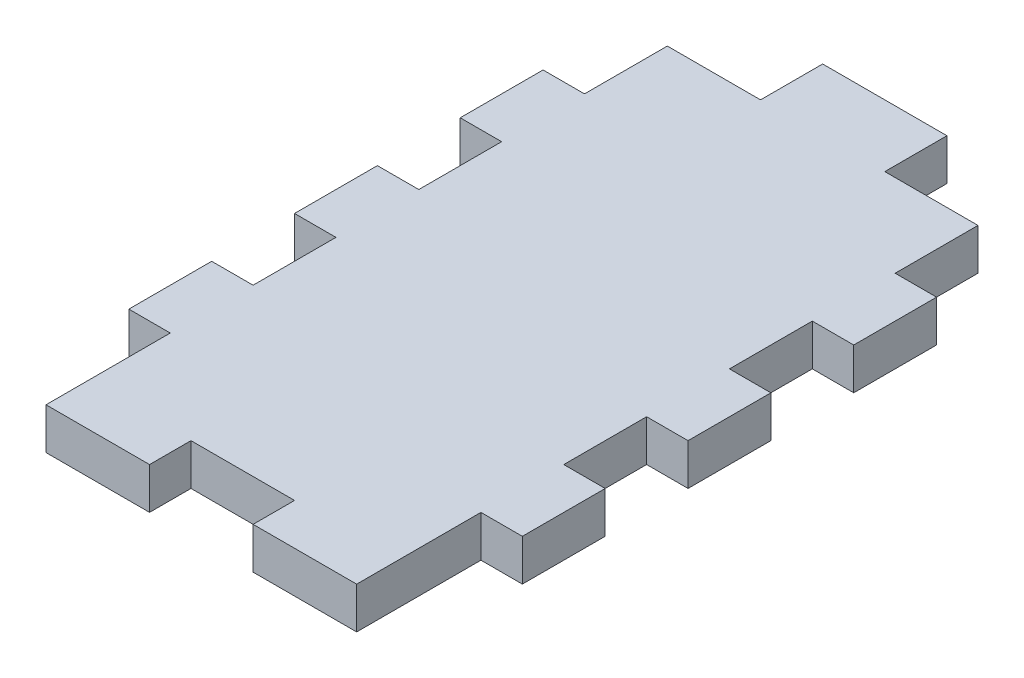
ISO-10303-21;
HEADER;
FILE_DESCRIPTION(('STEP AP214'),'2;1');
FILE_NAME('part.step','',(''),(''),'','','');
FILE_SCHEMA(('AUTOMOTIVE_DESIGN { 1 0 10303 214 1 1 1 1 }'));
ENDSEC;
DATA;
#1=APPLICATION_CONTEXT('core data for automotive mechanical design processes');
#2=APPLICATION_PROTOCOL_DEFINITION('international standard','automotive_design',2000,#1);
#3=PRODUCT_CONTEXT('',#1,'mechanical');
#4=PRODUCT('Part','Part','',(#3));
#5=PRODUCT_RELATED_PRODUCT_CATEGORY('part','',(#4));
#6=PRODUCT_DEFINITION_FORMATION('','',#4);
#7=PRODUCT_DEFINITION_CONTEXT('part definition',#1,'design');
#8=PRODUCT_DEFINITION('design','',#6,#7);
#9=PRODUCT_DEFINITION_SHAPE('','',#8);
#10=(LENGTH_UNIT() NAMED_UNIT(*) SI_UNIT(.MILLI.,.METRE.));
#11=(NAMED_UNIT(*) PLANE_ANGLE_UNIT() SI_UNIT($,.RADIAN.));
#12=(NAMED_UNIT(*) SI_UNIT($,.STERADIAN.) SOLID_ANGLE_UNIT());
#13=UNCERTAINTY_MEASURE_WITH_UNIT(LENGTH_MEASURE(1.E-05),#10,'distance_accuracy_value','');
#14=(GEOMETRIC_REPRESENTATION_CONTEXT(3) GLOBAL_UNCERTAINTY_ASSIGNED_CONTEXT((#13)) GLOBAL_UNIT_ASSIGNED_CONTEXT((#10,
#11,#12)) REPRESENTATION_CONTEXT('',''));
#15=CARTESIAN_POINT('',(0.,0.,0.));
#16=DIRECTION('',(0.,0.,1.));
#17=DIRECTION('',(1.,0.,0.));
#18=AXIS2_PLACEMENT_3D('',#15,#16,#17);
#19=CARTESIAN_POINT('',(-15.,4.,0.));
#20=DIRECTION('',(-1.,0.,0.));
#21=DIRECTION('',(0.,0.,1.));
#22=AXIS2_PLACEMENT_3D('',#19,#20,#21);
#23=PLANE('',#22);
#24=DIRECTION('',(0.,0.,-1.));
#25=VECTOR('',#24,1.);
#26=CARTESIAN_POINT('',(-15.,0.,0.));
#27=LINE('',#26,#25);
#28=CARTESIAN_POINT('',(-15.,0.,-6.));
#29=VERTEX_POINT('',#28);
#30=CARTESIAN_POINT('',(-15.,0.,-14.));
#31=VERTEX_POINT('',#30);
#32=EDGE_CURVE('E553',#29,#31,#27,.T.);
#33=ORIENTED_EDGE('',*,*,#32,.F.);
#34=DIRECTION('',(0.,-1.,0.));
#35=VECTOR('',#34,1.);
#36=CARTESIAN_POINT('',(-15.,4.,-6.));
#37=LINE('',#36,#35);
#38=CARTESIAN_POINT('',(-15.,4.,-6.));
#39=VERTEX_POINT('',#38);
#40=EDGE_CURVE('E669',#39,#29,#37,.T.);
#41=ORIENTED_EDGE('',*,*,#40,.F.);
#42=DIRECTION('',(0.,0.,-1.));
#43=VECTOR('',#42,1.);
#44=CARTESIAN_POINT('',(-15.,4.,0.));
#45=LINE('',#44,#43);
#46=CARTESIAN_POINT('',(-15.,4.,-14.));
#47=VERTEX_POINT('',#46);
#48=EDGE_CURVE('E734',#39,#47,#45,.T.);
#49=ORIENTED_EDGE('',*,*,#48,.T.);
#50=DIRECTION('',(0.,-1.,0.));
#51=VECTOR('',#50,1.);
#52=CARTESIAN_POINT('',(-15.,4.,-14.));
#53=LINE('',#52,#51);
#54=EDGE_CURVE('E671',#47,#31,#53,.T.);
#55=ORIENTED_EDGE('',*,*,#54,.T.);
#56=EDGE_LOOP('',(#33,#41,#49,#55));
#57=FACE_BOUND('',#56,.T.);
#58=ADVANCED_FACE('F259',(#57),#23,.T.);
#59=CARTESIAN_POINT('',(0.,0.,0.));
#60=DIRECTION('',(0.,1.,0.));
#61=DIRECTION('',(0.,0.,1.));
#62=AXIS2_PLACEMENT_3D('',#59,#60,#61);
#63=PLANE('',#62);
#64=DIRECTION('',(1.,0.,0.));
#65=VECTOR('',#64,1.);
#66=CARTESIAN_POINT('',(0.,0.,-22.));
#67=LINE('',#66,#65);
#68=CARTESIAN_POINT('',(15.,0.,-22.));
#69=VERTEX_POINT('',#68);
#70=CARTESIAN_POINT('',(19.,0.,-22.));
#71=VERTEX_POINT('',#70);
#72=EDGE_CURVE('E522',#69,#71,#67,.T.);
#73=ORIENTED_EDGE('',*,*,#72,.T.);
#74=DIRECTION('',(0.,0.,1.));
#75=VECTOR('',#74,1.);
#76=CARTESIAN_POINT('',(19.,0.,0.));
#77=LINE('',#76,#75);
#78=CARTESIAN_POINT('',(19.,0.,-14.));
#79=VERTEX_POINT('',#78);
#80=EDGE_CURVE('E616',#71,#79,#77,.T.);
#81=ORIENTED_EDGE('',*,*,#80,.T.);
#82=DIRECTION('',(1.,0.,0.));
#83=VECTOR('',#82,1.);
#84=CARTESIAN_POINT('',(0.,0.,-14.));
#85=LINE('',#84,#83);
#86=CARTESIAN_POINT('',(15.,0.,-14.));
#87=VERTEX_POINT('',#86);
#88=EDGE_CURVE('E614',#87,#79,#85,.T.);
#89=ORIENTED_EDGE('',*,*,#88,.F.);
#90=DIRECTION('',(0.,0.,-1.));
#91=VECTOR('',#90,1.);
#92=CARTESIAN_POINT('',(15.,0.,0.));
#93=LINE('',#92,#91);
#94=CARTESIAN_POINT('',(15.,0.,-6.00000000000001));
#95=VERTEX_POINT('',#94);
#96=EDGE_CURVE('E511',#95,#87,#93,.T.);
#97=ORIENTED_EDGE('',*,*,#96,.F.);
#98=DIRECTION('',(1.,0.,0.));
#99=VECTOR('',#98,1.);
#100=CARTESIAN_POINT('',(0.,0.,-5.99999999999999));
#101=LINE('',#100,#99);
#102=CARTESIAN_POINT('',(19.,0.,-6.00000000000002));
#103=VERTEX_POINT('',#102);
#104=EDGE_CURVE('E610',#95,#103,#101,.T.);
#105=ORIENTED_EDGE('',*,*,#104,.T.);
#106=DIRECTION('',(0.,0.,1.));
#107=VECTOR('',#106,1.);
#108=CARTESIAN_POINT('',(19.,0.,0.));
#109=LINE('',#108,#107);
#110=CARTESIAN_POINT('',(19.,0.,1.99999999999998));
#111=VERTEX_POINT('',#110);
#112=EDGE_CURVE('E607',#103,#111,#109,.T.);
#113=ORIENTED_EDGE('',*,*,#112,.T.);
#114=DIRECTION('',(1.,0.,0.));
#115=VECTOR('',#114,1.);
#116=CARTESIAN_POINT('',(0.,0.,1.99999999999998));
#117=LINE('',#116,#115);
#118=CARTESIAN_POINT('',(15.,0.,1.99999999999998));
#119=VERTEX_POINT('',#118);
#120=EDGE_CURVE('E604',#119,#111,#117,.T.);
#121=ORIENTED_EDGE('',*,*,#120,.F.);
#122=DIRECTION('',(0.,0.,-1.));
#123=VECTOR('',#122,1.);
#124=CARTESIAN_POINT('',(15.,0.,0.));
#125=LINE('',#124,#123);
#126=CARTESIAN_POINT('',(15.,0.,9.99999999999998));
#127=VERTEX_POINT('',#126);
#128=EDGE_CURVE('E602',#127,#119,#125,.T.);
#129=ORIENTED_EDGE('',*,*,#128,.F.);
#130=DIRECTION('',(1.,0.,0.));
#131=VECTOR('',#130,1.);
#132=CARTESIAN_POINT('',(0.,0.,9.99999999999998));
#133=LINE('',#132,#131);
#134=CARTESIAN_POINT('',(19.,0.,9.99999999999998));
#135=VERTEX_POINT('',#134);
#136=EDGE_CURVE('E599',#127,#135,#133,.T.);
#137=ORIENTED_EDGE('',*,*,#136,.T.);
#138=DIRECTION('',(0.,0.,1.));
#139=VECTOR('',#138,1.);
#140=CARTESIAN_POINT('',(19.,0.,0.));
#141=LINE('',#140,#139);
#142=CARTESIAN_POINT('',(19.,0.,18.));
#143=VERTEX_POINT('',#142);
#144=EDGE_CURVE('E596',#135,#143,#141,.T.);
#145=ORIENTED_EDGE('',*,*,#144,.T.);
#146=DIRECTION('',(1.,0.,0.));
#147=VECTOR('',#146,1.);
#148=CARTESIAN_POINT('',(0.,0.,18.));
#149=LINE('',#148,#147);
#150=CARTESIAN_POINT('',(15.,0.,18.));
#151=VERTEX_POINT('',#150);
#152=EDGE_CURVE('E593',#151,#143,#149,.T.);
#153=ORIENTED_EDGE('',*,*,#152,.F.);
#154=DIRECTION('',(0.,0.,1.));
#155=VECTOR('',#154,1.);
#156=CARTESIAN_POINT('',(15.,0.,0.));
#157=LINE('',#156,#155);
#158=CARTESIAN_POINT('',(15.,0.,30.));
#159=VERTEX_POINT('',#158);
#160=EDGE_CURVE('E590',#151,#159,#157,.T.);
#161=ORIENTED_EDGE('',*,*,#160,.T.);
#162=DIRECTION('',(1.,0.,0.));
#163=VECTOR('',#162,1.);
#164=CARTESIAN_POINT('',(0.,0.,30.));
#165=LINE('',#164,#163);
#166=CARTESIAN_POINT('',(5.00000000000002,0.,30.));
#167=VERTEX_POINT('',#166);
#168=EDGE_CURVE('E587',#167,#159,#165,.T.);
#169=ORIENTED_EDGE('',*,*,#168,.F.);
#170=DIRECTION('',(0.,0.,1.));
#171=VECTOR('',#170,1.);
#172=CARTESIAN_POINT('',(5.00000000000002,0.,0.));
#173=LINE('',#172,#171);
#174=CARTESIAN_POINT('',(5.00000000000002,0.,26.));
#175=VERTEX_POINT('',#174);
#176=EDGE_CURVE('E585',#175,#167,#173,.T.);
#177=ORIENTED_EDGE('',*,*,#176,.F.);
#178=DIRECTION('',(1.,0.,0.));
#179=VECTOR('',#178,1.);
#180=CARTESIAN_POINT('',(0.,0.,26.));
#181=LINE('',#180,#179);
#182=CARTESIAN_POINT('',(-4.99999999999998,0.,26.));
#183=VERTEX_POINT('',#182);
#184=EDGE_CURVE('E583',#183,#175,#181,.T.);
#185=ORIENTED_EDGE('',*,*,#184,.F.);
#186=DIRECTION('',(0.,0.,1.));
#187=VECTOR('',#186,1.);
#188=CARTESIAN_POINT('',(-4.99999999999998,0.,0.));
#189=LINE('',#188,#187);
#190=CARTESIAN_POINT('',(-4.99999999999998,0.,30.));
#191=VERTEX_POINT('',#190);
#192=EDGE_CURVE('E580',#183,#191,#189,.T.);
#193=ORIENTED_EDGE('',*,*,#192,.T.);
#194=DIRECTION('',(1.,0.,0.));
#195=VECTOR('',#194,1.);
#196=CARTESIAN_POINT('',(0.,0.,30.));
#197=LINE('',#196,#195);
#198=CARTESIAN_POINT('',(-15.,0.,30.));
#199=VERTEX_POINT('',#198);
#200=EDGE_CURVE('E577',#199,#191,#197,.T.);
#201=ORIENTED_EDGE('',*,*,#200,.F.);
#202=DIRECTION('',(0.,0.,1.));
#203=VECTOR('',#202,1.);
#204=CARTESIAN_POINT('',(-15.,0.,0.));
#205=LINE('',#204,#203);
#206=CARTESIAN_POINT('',(-15.,0.,18.));
#207=VERTEX_POINT('',#206);
#208=EDGE_CURVE('E575',#207,#199,#205,.T.);
#209=ORIENTED_EDGE('',*,*,#208,.F.);
#210=DIRECTION('',(-1.,0.,0.));
#211=VECTOR('',#210,1.);
#212=CARTESIAN_POINT('',(0.,0.,18.));
#213=LINE('',#212,#211);
#214=CARTESIAN_POINT('',(-19.,0.,18.));
#215=VERTEX_POINT('',#214);
#216=EDGE_CURVE('E572',#207,#215,#213,.T.);
#217=ORIENTED_EDGE('',*,*,#216,.T.);
#218=DIRECTION('',(0.,0.,1.));
#219=VECTOR('',#218,1.);
#220=CARTESIAN_POINT('',(-19.,0.,0.));
#221=LINE('',#220,#219);
#222=CARTESIAN_POINT('',(-19.,0.,10.));
#223=VERTEX_POINT('',#222);
#224=EDGE_CURVE('E569',#223,#215,#221,.T.);
#225=ORIENTED_EDGE('',*,*,#224,.F.);
#226=DIRECTION('',(-1.,0.,0.));
#227=VECTOR('',#226,1.);
#228=CARTESIAN_POINT('',(0.,0.,10.));
#229=LINE('',#228,#227);
#230=CARTESIAN_POINT('',(-15.,0.,10.));
#231=VERTEX_POINT('',#230);
#232=EDGE_CURVE('E567',#231,#223,#229,.T.);
#233=ORIENTED_EDGE('',*,*,#232,.F.);
#234=DIRECTION('',(0.,0.,-1.));
#235=VECTOR('',#234,1.);
#236=CARTESIAN_POINT('',(-15.,0.,0.));
#237=LINE('',#236,#235);
#238=CARTESIAN_POINT('',(-15.,0.,2.));
#239=VERTEX_POINT('',#238);
#240=EDGE_CURVE('E564',#231,#239,#237,.T.);
#241=ORIENTED_EDGE('',*,*,#240,.T.);
#242=DIRECTION('',(-1.,0.,0.));
#243=VECTOR('',#242,1.);
#244=CARTESIAN_POINT('',(0.,0.,1.99999999999999));
#245=LINE('',#244,#243);
#246=CARTESIAN_POINT('',(-19.,0.,2.));
#247=VERTEX_POINT('',#246);
#248=EDGE_CURVE('E561',#239,#247,#245,.T.);
#249=ORIENTED_EDGE('',*,*,#248,.T.);
#250=DIRECTION('',(0.,0.,1.));
#251=VECTOR('',#250,1.);
#252=CARTESIAN_POINT('',(-19.,0.,0.));
#253=LINE('',#252,#251);
#254=CARTESIAN_POINT('',(-19.,0.,-6.));
#255=VERTEX_POINT('',#254);
#256=EDGE_CURVE('E558',#255,#247,#253,.T.);
#257=ORIENTED_EDGE('',*,*,#256,.F.);
#258=DIRECTION('',(-1.,0.,0.));
#259=VECTOR('',#258,1.);
#260=CARTESIAN_POINT('',(0.,0.,-6.00000000000001));
#261=LINE('',#260,#259);
#262=EDGE_CURVE('E556',#29,#255,#261,.T.);
#263=ORIENTED_EDGE('',*,*,#262,.F.);
#264=ORIENTED_EDGE('',*,*,#32,.T.);
#265=DIRECTION('',(-1.,0.,0.));
#266=VECTOR('',#265,1.);
#267=CARTESIAN_POINT('',(0.,0.,-14.));
#268=LINE('',#267,#266);
#269=CARTESIAN_POINT('',(-19.,0.,-14.));
#270=VERTEX_POINT('',#269);
#271=EDGE_CURVE('E550',#31,#270,#268,.T.);
#272=ORIENTED_EDGE('',*,*,#271,.T.);
#273=DIRECTION('',(0.,0.,1.));
#274=VECTOR('',#273,1.);
#275=CARTESIAN_POINT('',(-19.,0.,0.));
#276=LINE('',#275,#274);
#277=CARTESIAN_POINT('',(-19.,0.,-22.));
#278=VERTEX_POINT('',#277);
#279=EDGE_CURVE('E547',#278,#270,#276,.T.);
#280=ORIENTED_EDGE('',*,*,#279,.F.);
#281=DIRECTION('',(-1.,0.,0.));
#282=VECTOR('',#281,1.);
#283=CARTESIAN_POINT('',(0.,0.,-22.));
#284=LINE('',#283,#282);
#285=CARTESIAN_POINT('',(-15.,0.,-22.));
#286=VERTEX_POINT('',#285);
#287=EDGE_CURVE('E545',#286,#278,#284,.T.);
#288=ORIENTED_EDGE('',*,*,#287,.F.);
#289=DIRECTION('',(0.,0.,-1.));
#290=VECTOR('',#289,1.);
#291=CARTESIAN_POINT('',(-15.,0.,0.));
#292=LINE('',#291,#290);
#293=CARTESIAN_POINT('',(-15.,0.,-30.));
#294=VERTEX_POINT('',#293);
#295=EDGE_CURVE('E542',#286,#294,#292,.T.);
#296=ORIENTED_EDGE('',*,*,#295,.T.);
#297=DIRECTION('',(1.,0.,0.));
#298=VECTOR('',#297,1.);
#299=CARTESIAN_POINT('',(0.,0.,-30.));
#300=LINE('',#299,#298);
#301=CARTESIAN_POINT('',(-6.00000000000001,0.,-30.));
#302=VERTEX_POINT('',#301);
#303=EDGE_CURVE('E539',#294,#302,#300,.T.);
#304=ORIENTED_EDGE('',*,*,#303,.T.);
#305=DIRECTION('',(0.,0.,-1.));
#306=VECTOR('',#305,1.);
#307=CARTESIAN_POINT('',(-6.0000000000001,0.,0.));
#308=LINE('',#307,#306);
#309=CARTESIAN_POINT('',(-5.99999999999999,0.,-36.));
#310=VERTEX_POINT('',#309);
#311=EDGE_CURVE('E536',#302,#310,#308,.T.);
#312=ORIENTED_EDGE('',*,*,#311,.T.);
#313=DIRECTION('',(1.,0.,0.));
#314=VECTOR('',#313,1.);
#315=CARTESIAN_POINT('',(0.,0.,-36.));
#316=LINE('',#315,#314);
#317=CARTESIAN_POINT('',(6.00000000000001,0.,-36.));
#318=VERTEX_POINT('',#317);
#319=EDGE_CURVE('E533',#310,#318,#316,.T.);
#320=ORIENTED_EDGE('',*,*,#319,.T.);
#321=DIRECTION('',(0.,0.,-1.));
#322=VECTOR('',#321,1.);
#323=CARTESIAN_POINT('',(5.9999999999999,0.,0.));
#324=LINE('',#323,#322);
#325=CARTESIAN_POINT('',(5.99999999999999,0.,-30.));
#326=VERTEX_POINT('',#325);
#327=EDGE_CURVE('E530',#326,#318,#324,.T.);
#328=ORIENTED_EDGE('',*,*,#327,.F.);
#329=DIRECTION('',(1.,0.,0.));
#330=VECTOR('',#329,1.);
#331=CARTESIAN_POINT('',(0.,0.,-30.));
#332=LINE('',#331,#330);
#333=CARTESIAN_POINT('',(15.,0.,-30.));
#334=VERTEX_POINT('',#333);
#335=EDGE_CURVE('E527',#326,#334,#332,.T.);
#336=ORIENTED_EDGE('',*,*,#335,.T.);
#337=DIRECTION('',(0.,0.,-1.));
#338=VECTOR('',#337,1.);
#339=CARTESIAN_POINT('',(14.9999999999999,0.,0.));
#340=LINE('',#339,#338);
#341=EDGE_CURVE('E524',#69,#334,#340,.T.);
#342=ORIENTED_EDGE('',*,*,#341,.F.);
#343=EDGE_LOOP('',(#73,#81,#89,#97,#105,#113,#121,#129,#137,#145,#153,#161,#169,#177,#185,#193,
#201,#209,#217,#225,#233,#241,#249,#257,#263,#264,#272,#280,#288,#296,#304,#312,#320,#328,#336,#342));
#344=FACE_BOUND('',#343,.T.);
#345=ADVANCED_FACE('F701',(#344),#63,.F.);
#346=CARTESIAN_POINT('',(0.,4.,-14.));
#347=DIRECTION('',(0.,0.,1.));
#348=DIRECTION('',(1.,0.,0.));
#349=AXIS2_PLACEMENT_3D('',#346,#347,#348);
#350=PLANE('',#349);
#351=ORIENTED_EDGE('',*,*,#271,.F.);
#352=ORIENTED_EDGE('',*,*,#54,.F.);
#353=DIRECTION('',(-1.,0.,0.));
#354=VECTOR('',#353,1.);
#355=CARTESIAN_POINT('',(0.,4.,-14.));
#356=LINE('',#355,#354);
#357=CARTESIAN_POINT('',(-19.,4.,-14.));
#358=VERTEX_POINT('',#357);
#359=EDGE_CURVE('E731',#47,#358,#356,.T.);
#360=ORIENTED_EDGE('',*,*,#359,.T.);
#361=DIRECTION('',(0.,-1.,0.));
#362=VECTOR('',#361,1.);
#363=CARTESIAN_POINT('',(-19.,4.,-14.));
#364=LINE('',#363,#362);
#365=EDGE_CURVE('E673',#358,#270,#364,.T.);
#366=ORIENTED_EDGE('',*,*,#365,.T.);
#367=EDGE_LOOP('',(#351,#352,#360,#366));
#368=FACE_BOUND('',#367,.T.);
#369=ADVANCED_FACE('F798',(#368),#350,.T.);
#370=CARTESIAN_POINT('',(-19.,4.,0.));
#371=DIRECTION('',(1.,0.,0.));
#372=DIRECTION('',(0.,0.,-1.));
#373=AXIS2_PLACEMENT_3D('',#370,#371,#372);
#374=PLANE('',#373);
#375=ORIENTED_EDGE('',*,*,#279,.T.);
#376=ORIENTED_EDGE('',*,*,#365,.F.);
#377=DIRECTION('',(0.,0.,1.));
#378=VECTOR('',#377,1.);
#379=CARTESIAN_POINT('',(-19.,4.,0.));
#380=LINE('',#379,#378);
#381=CARTESIAN_POINT('',(-19.,4.,-22.));
#382=VERTEX_POINT('',#381);
#383=EDGE_CURVE('E729',#382,#358,#380,.T.);
#384=ORIENTED_EDGE('',*,*,#383,.F.);
#385=DIRECTION('',(0.,-1.,0.));
#386=VECTOR('',#385,1.);
#387=CARTESIAN_POINT('',(-19.,4.,-22.));
#388=LINE('',#387,#386);
#389=EDGE_CURVE('E675',#382,#278,#388,.T.);
#390=ORIENTED_EDGE('',*,*,#389,.T.);
#391=EDGE_LOOP('',(#375,#376,#384,#390));
#392=FACE_BOUND('',#391,.T.);
#393=ADVANCED_FACE('F803',(#392),#374,.F.);
#394=CARTESIAN_POINT('',(0.,4.,-22.));
#395=DIRECTION('',(0.,0.,1.));
#396=DIRECTION('',(1.,0.,0.));
#397=AXIS2_PLACEMENT_3D('',#394,#395,#396);
#398=PLANE('',#397);
#399=ORIENTED_EDGE('',*,*,#287,.T.);
#400=ORIENTED_EDGE('',*,*,#389,.F.);
#401=DIRECTION('',(-1.,0.,0.));
#402=VECTOR('',#401,1.);
#403=CARTESIAN_POINT('',(0.,4.,-22.));
#404=LINE('',#403,#402);
#405=CARTESIAN_POINT('',(-15.,4.,-22.));
#406=VERTEX_POINT('',#405);
#407=EDGE_CURVE('E727',#406,#382,#404,.T.);
#408=ORIENTED_EDGE('',*,*,#407,.F.);
#409=DIRECTION('',(0.,-1.,0.));
#410=VECTOR('',#409,1.);
#411=CARTESIAN_POINT('',(-15.,4.,-22.));
#412=LINE('',#411,#410);
#413=EDGE_CURVE('E678',#406,#286,#412,.T.);
#414=ORIENTED_EDGE('',*,*,#413,.T.);
#415=EDGE_LOOP('',(#399,#400,#408,#414));
#416=FACE_BOUND('',#415,.T.);
#417=ADVANCED_FACE('F827',(#416),#398,.F.);
#418=CARTESIAN_POINT('',(-15.,4.,0.));
#419=DIRECTION('',(-1.,0.,0.));
#420=DIRECTION('',(0.,0.,1.));
#421=AXIS2_PLACEMENT_3D('',#418,#419,#420);
#422=PLANE('',#421);
#423=ORIENTED_EDGE('',*,*,#295,.F.);
#424=ORIENTED_EDGE('',*,*,#413,.F.);
#425=DIRECTION('',(0.,0.,-1.));
#426=VECTOR('',#425,1.);
#427=CARTESIAN_POINT('',(-15.,4.,0.));
#428=LINE('',#427,#426);
#429=CARTESIAN_POINT('',(-15.,4.,-30.));
#430=VERTEX_POINT('',#429);
#431=EDGE_CURVE('E724',#406,#430,#428,.T.);
#432=ORIENTED_EDGE('',*,*,#431,.T.);
#433=DIRECTION('',(0.,-1.,0.));
#434=VECTOR('',#433,1.);
#435=CARTESIAN_POINT('',(-15.,4.,-30.));
#436=LINE('',#435,#434);
#437=EDGE_CURVE('E680',#430,#294,#436,.T.);
#438=ORIENTED_EDGE('',*,*,#437,.T.);
#439=EDGE_LOOP('',(#423,#424,#432,#438));
#440=FACE_BOUND('',#439,.T.);
#441=ADVANCED_FACE('F831',(#440),#422,.T.);
#442=CARTESIAN_POINT('',(0.,4.,-30.));
#443=DIRECTION('',(0.,0.,-1.));
#444=DIRECTION('',(-1.,0.,0.));
#445=AXIS2_PLACEMENT_3D('',#442,#443,#444);
#446=PLANE('',#445);
#447=ORIENTED_EDGE('',*,*,#303,.F.);
#448=ORIENTED_EDGE('',*,*,#437,.F.);
#449=DIRECTION('',(1.,0.,0.));
#450=VECTOR('',#449,1.);
#451=CARTESIAN_POINT('',(0.,4.,-30.));
#452=LINE('',#451,#450);
#453=CARTESIAN_POINT('',(-6.00000000000001,4.,-30.));
#454=VERTEX_POINT('',#453);
#455=EDGE_CURVE('E721',#430,#454,#452,.T.);
#456=ORIENTED_EDGE('',*,*,#455,.T.);
#457=DIRECTION('',(0.,-1.,0.));
#458=VECTOR('',#457,1.);
#459=CARTESIAN_POINT('',(-6.00000000000001,4.,-30.));
#460=LINE('',#459,#458);
#461=EDGE_CURVE('E682',#454,#302,#460,.T.);
#462=ORIENTED_EDGE('',*,*,#461,.T.);
#463=EDGE_LOOP('',(#447,#448,#456,#462));
#464=FACE_BOUND('',#463,.T.);
#465=ADVANCED_FACE('F835',(#464),#446,.T.);
#466=CARTESIAN_POINT('',(-6.0000000000001,4.,0.));
#467=DIRECTION('',(-1.,0.,0.));
#468=DIRECTION('',(0.,0.,1.));
#469=AXIS2_PLACEMENT_3D('',#466,#467,#468);
#470=PLANE('',#469);
#471=ORIENTED_EDGE('',*,*,#311,.F.);
#472=ORIENTED_EDGE('',*,*,#461,.F.);
#473=DIRECTION('',(0.,0.,-1.));
#474=VECTOR('',#473,1.);
#475=CARTESIAN_POINT('',(-6.0000000000001,4.,0.));
#476=LINE('',#475,#474);
#477=CARTESIAN_POINT('',(-5.99999999999999,4.,-36.));
#478=VERTEX_POINT('',#477);
#479=EDGE_CURVE('E718',#454,#478,#476,.T.);
#480=ORIENTED_EDGE('',*,*,#479,.T.);
#481=DIRECTION('',(0.,-1.,0.));
#482=VECTOR('',#481,1.);
#483=CARTESIAN_POINT('',(-5.99999999999999,4.,-36.));
#484=LINE('',#483,#482);
#485=EDGE_CURVE('E684',#478,#310,#484,.T.);
#486=ORIENTED_EDGE('',*,*,#485,.T.);
#487=EDGE_LOOP('',(#471,#472,#480,#486));
#488=FACE_BOUND('',#487,.T.);
#489=ADVANCED_FACE('F839',(#488),#470,.T.);
#490=CARTESIAN_POINT('',(0.,4.,-36.));
#491=DIRECTION('',(0.,0.,-1.));
#492=DIRECTION('',(-1.,0.,0.));
#493=AXIS2_PLACEMENT_3D('',#490,#491,#492);
#494=PLANE('',#493);
#495=ORIENTED_EDGE('',*,*,#319,.F.);
#496=ORIENTED_EDGE('',*,*,#485,.F.);
#497=DIRECTION('',(1.,0.,0.));
#498=VECTOR('',#497,1.);
#499=CARTESIAN_POINT('',(0.,4.,-36.));
#500=LINE('',#499,#498);
#501=CARTESIAN_POINT('',(6.00000000000001,4.,-36.));
#502=VERTEX_POINT('',#501);
#503=EDGE_CURVE('E710',#478,#502,#500,.T.);
#504=ORIENTED_EDGE('',*,*,#503,.T.);
#505=DIRECTION('',(0.,-1.,0.));
#506=VECTOR('',#505,1.);
#507=CARTESIAN_POINT('',(6.00000000000001,4.,-36.));
#508=LINE('',#507,#506);
#509=EDGE_CURVE('E686',#502,#318,#508,.T.);
#510=ORIENTED_EDGE('',*,*,#509,.T.);
#511=EDGE_LOOP('',(#495,#496,#504,#510));
#512=FACE_BOUND('',#511,.T.);
#513=ADVANCED_FACE('F843',(#512),#494,.T.);
#514=CARTESIAN_POINT('',(5.9999999999999,4.,0.));
#515=DIRECTION('',(-1.,0.,0.));
#516=DIRECTION('',(0.,0.,1.));
#517=AXIS2_PLACEMENT_3D('',#514,#515,#516);
#518=PLANE('',#517);
#519=ORIENTED_EDGE('',*,*,#327,.T.);
#520=ORIENTED_EDGE('',*,*,#509,.F.);
#521=DIRECTION('',(0.,0.,-1.));
#522=VECTOR('',#521,1.);
#523=CARTESIAN_POINT('',(5.9999999999999,4.,0.));
#524=LINE('',#523,#522);
#525=CARTESIAN_POINT('',(5.99999999999999,4.,-30.));
#526=VERTEX_POINT('',#525);
#527=EDGE_CURVE('E708',#526,#502,#524,.T.);
#528=ORIENTED_EDGE('',*,*,#527,.F.);
#529=DIRECTION('',(0.,-1.,0.));
#530=VECTOR('',#529,1.);
#531=CARTESIAN_POINT('',(5.99999999999999,4.,-30.));
#532=LINE('',#531,#530);
#533=EDGE_CURVE('E688',#526,#326,#532,.T.);
#534=ORIENTED_EDGE('',*,*,#533,.T.);
#535=EDGE_LOOP('',(#519,#520,#528,#534));
#536=FACE_BOUND('',#535,.T.);
#537=ADVANCED_FACE('F705',(#536),#518,.F.);
#538=CARTESIAN_POINT('',(0.,4.,-30.));
#539=DIRECTION('',(0.,0.,-1.));
#540=DIRECTION('',(-1.,0.,0.));
#541=AXIS2_PLACEMENT_3D('',#538,#539,#540);
#542=PLANE('',#541);
#543=ORIENTED_EDGE('',*,*,#335,.F.);
#544=ORIENTED_EDGE('',*,*,#533,.F.);
#545=DIRECTION('',(1.,0.,0.));
#546=VECTOR('',#545,1.);
#547=CARTESIAN_POINT('',(0.,4.,-30.));
#548=LINE('',#547,#546);
#549=CARTESIAN_POINT('',(15.,4.,-30.));
#550=VERTEX_POINT('',#549);
#551=EDGE_CURVE('E695',#526,#550,#548,.T.);
#552=ORIENTED_EDGE('',*,*,#551,.T.);
#553=DIRECTION('',(0.,-1.,0.));
#554=VECTOR('',#553,1.);
#555=CARTESIAN_POINT('',(15.,4.,-30.));
#556=LINE('',#555,#554);
#557=EDGE_CURVE('E268',#550,#334,#556,.T.);
#558=ORIENTED_EDGE('',*,*,#557,.T.);
#559=EDGE_LOOP('',(#543,#544,#552,#558));
#560=FACE_BOUND('',#559,.T.);
#561=ADVANCED_FACE('F693',(#560),#542,.T.);
#562=CARTESIAN_POINT('',(14.9999999999999,4.,0.));
#563=DIRECTION('',(-1.,0.,0.));
#564=DIRECTION('',(0.,0.,1.));
#565=AXIS2_PLACEMENT_3D('',#562,#563,#564);
#566=PLANE('',#565);
#567=ORIENTED_EDGE('',*,*,#341,.T.);
#568=ORIENTED_EDGE('',*,*,#557,.F.);
#569=DIRECTION('',(0.,0.,-1.));
#570=VECTOR('',#569,1.);
#571=CARTESIAN_POINT('',(14.9999999999999,4.,0.));
#572=LINE('',#571,#570);
#573=CARTESIAN_POINT('',(15.,4.,-22.));
#574=VERTEX_POINT('',#573);
#575=EDGE_CURVE('E712',#574,#550,#572,.T.);
#576=ORIENTED_EDGE('',*,*,#575,.F.);
#577=DIRECTION('',(0.,-1.,0.));
#578=VECTOR('',#577,1.);
#579=CARTESIAN_POINT('',(15.,4.,-22.));
#580=LINE('',#579,#578);
#581=EDGE_CURVE('E12',#574,#69,#580,.T.);
#582=ORIENTED_EDGE('',*,*,#581,.T.);
#583=EDGE_LOOP('',(#567,#568,#576,#582));
#584=FACE_BOUND('',#583,.T.);
#585=ADVANCED_FACE('F698',(#584),#566,.F.);
#586=CARTESIAN_POINT('',(0.,4.,-22.));
#587=DIRECTION('',(0.,0.,-1.));
#588=DIRECTION('',(-1.,0.,0.));
#589=AXIS2_PLACEMENT_3D('',#586,#587,#588);
#590=PLANE('',#589);
#591=ORIENTED_EDGE('',*,*,#72,.F.);
#592=ORIENTED_EDGE('',*,*,#581,.F.);
#593=DIRECTION('',(1.,0.,0.));
#594=VECTOR('',#593,1.);
#595=CARTESIAN_POINT('',(0.,4.,-22.));
#596=LINE('',#595,#594);
#597=CARTESIAN_POINT('',(19.,4.,-22.));
#598=VERTEX_POINT('',#597);
#599=EDGE_CURVE('E619',#574,#598,#596,.T.);
#600=ORIENTED_EDGE('',*,*,#599,.T.);
#601=DIRECTION('',(0.,-1.,0.));
#602=VECTOR('',#601,1.);
#603=CARTESIAN_POINT('',(19.,4.,-22.));
#604=LINE('',#603,#602);
#605=EDGE_CURVE('E276',#598,#71,#604,.T.);
#606=ORIENTED_EDGE('',*,*,#605,.T.);
#607=EDGE_LOOP('',(#591,#592,#600,#606));
#608=FACE_BOUND('',#607,.T.);
#609=ADVANCED_FACE('F261',(#608),#590,.T.);
#610=CARTESIAN_POINT('',(19.,4.,0.));
#611=DIRECTION('',(1.,0.,0.));
#612=DIRECTION('',(0.,0.,-1.));
#613=AXIS2_PLACEMENT_3D('',#610,#611,#612);
#614=PLANE('',#613);
#615=ORIENTED_EDGE('',*,*,#80,.F.);
#616=ORIENTED_EDGE('',*,*,#605,.F.);
#617=DIRECTION('',(0.,0.,1.));
#618=VECTOR('',#617,1.);
#619=CARTESIAN_POINT('',(19.,4.,0.));
#620=LINE('',#619,#618);
#621=CARTESIAN_POINT('',(19.,4.,-14.));
#622=VERTEX_POINT('',#621);
#623=EDGE_CURVE('E517',#598,#622,#620,.T.);
#624=ORIENTED_EDGE('',*,*,#623,.T.);
#625=DIRECTION('',(0.,-1.,0.));
#626=VECTOR('',#625,1.);
#627=CARTESIAN_POINT('',(19.,4.,-14.));
#628=LINE('',#627,#626);
#629=EDGE_CURVE('E386',#622,#79,#628,.T.);
#630=ORIENTED_EDGE('',*,*,#629,.T.);
#631=EDGE_LOOP('',(#615,#616,#624,#630));
#632=FACE_BOUND('',#631,.T.);
#633=ADVANCED_FACE('F788',(#632),#614,.T.);
#634=CARTESIAN_POINT('',(0.,4.,-14.));
#635=DIRECTION('',(0.,0.,-1.));
#636=DIRECTION('',(-1.,0.,0.));
#637=AXIS2_PLACEMENT_3D('',#634,#635,#636);
#638=PLANE('',#637);
#639=ORIENTED_EDGE('',*,*,#88,.T.);
#640=ORIENTED_EDGE('',*,*,#629,.F.);
#641=DIRECTION('',(1.,0.,0.));
#642=VECTOR('',#641,1.);
#643=CARTESIAN_POINT('',(0.,4.,-14.));
#644=LINE('',#643,#642);
#645=CARTESIAN_POINT('',(15.,4.,-14.));
#646=VERTEX_POINT('',#645);
#647=EDGE_CURVE('E501',#646,#622,#644,.T.);
#648=ORIENTED_EDGE('',*,*,#647,.F.);
#649=DIRECTION('',(0.,-1.,0.));
#650=VECTOR('',#649,1.);
#651=CARTESIAN_POINT('',(15.,4.,-14.));
#652=LINE('',#651,#650);
#653=EDGE_CURVE('E508',#646,#87,#652,.T.);
#654=ORIENTED_EDGE('',*,*,#653,.T.);
#655=EDGE_LOOP('',(#639,#640,#648,#654));
#656=FACE_BOUND('',#655,.T.);
#657=ADVANCED_FACE('F516',(#656),#638,.F.);
#658=CARTESIAN_POINT('',(15.,4.,0.));
#659=DIRECTION('',(-1.,0.,0.));
#660=DIRECTION('',(0.,0.,1.));
#661=AXIS2_PLACEMENT_3D('',#658,#659,#660);
#662=PLANE('',#661);
#663=ORIENTED_EDGE('',*,*,#96,.T.);
#664=ORIENTED_EDGE('',*,*,#653,.F.);
#665=DIRECTION('',(0.,0.,-1.));
#666=VECTOR('',#665,1.);
#667=CARTESIAN_POINT('',(15.,4.,0.));
#668=LINE('',#667,#666);
#669=CARTESIAN_POINT('',(15.,4.,-6.00000000000001));
#670=VERTEX_POINT('',#669);
#671=EDGE_CURVE('E495',#670,#646,#668,.T.);
#672=ORIENTED_EDGE('',*,*,#671,.F.);
#673=DIRECTION('',(0.,-1.,0.));
#674=VECTOR('',#673,1.);
#675=CARTESIAN_POINT('',(15.,4.,-6.00000000000001));
#676=LINE('',#675,#674);
#677=EDGE_CURVE('E514',#670,#95,#676,.T.);
#678=ORIENTED_EDGE('',*,*,#677,.T.);
#679=EDGE_LOOP('',(#663,#664,#672,#678));
#680=FACE_BOUND('',#679,.T.);
#681=ADVANCED_FACE('F509',(#680),#662,.F.);
#682=CARTESIAN_POINT('',(0.,4.,-5.99999999999999));
#683=DIRECTION('',(0.,0.,-1.));
#684=DIRECTION('',(-1.,0.,0.));
#685=AXIS2_PLACEMENT_3D('',#682,#683,#684);
#686=PLANE('',#685);
#687=ORIENTED_EDGE('',*,*,#104,.F.);
#688=ORIENTED_EDGE('',*,*,#677,.F.);
#689=DIRECTION('',(1.,0.,0.));
#690=VECTOR('',#689,1.);
#691=CARTESIAN_POINT('',(0.,4.,-5.99999999999999));
#692=LINE('',#691,#690);
#693=CARTESIAN_POINT('',(19.,4.,-6.00000000000002));
#694=VERTEX_POINT('',#693);
#695=EDGE_CURVE('E504',#670,#694,#692,.T.);
#696=ORIENTED_EDGE('',*,*,#695,.T.);
#697=DIRECTION('',(0.,-1.,0.));
#698=VECTOR('',#697,1.);
#699=CARTESIAN_POINT('',(19.,4.,-6.00000000000002));
#700=LINE('',#699,#698);
#701=EDGE_CURVE('E623',#694,#103,#700,.T.);
#702=ORIENTED_EDGE('',*,*,#701,.T.);
#703=EDGE_LOOP('',(#687,#688,#696,#702));
#704=FACE_BOUND('',#703,.T.);
#705=ADVANCED_FACE('F786',(#704),#686,.T.);
#706=CARTESIAN_POINT('',(19.,4.,0.));
#707=DIRECTION('',(1.,0.,0.));
#708=DIRECTION('',(0.,0.,-1.));
#709=AXIS2_PLACEMENT_3D('',#706,#707,#708);
#710=PLANE('',#709);
#711=ORIENTED_EDGE('',*,*,#112,.F.);
#712=ORIENTED_EDGE('',*,*,#701,.F.);
#713=DIRECTION('',(0.,0.,1.));
#714=VECTOR('',#713,1.);
#715=CARTESIAN_POINT('',(19.,4.,0.));
#716=LINE('',#715,#714);
#717=CARTESIAN_POINT('',(19.,4.,1.99999999999998));
#718=VERTEX_POINT('',#717);
#719=EDGE_CURVE('E782',#694,#718,#716,.T.);
#720=ORIENTED_EDGE('',*,*,#719,.T.);
#721=DIRECTION('',(0.,-1.,0.));
#722=VECTOR('',#721,1.);
#723=CARTESIAN_POINT('',(19.,4.,1.99999999999998));
#724=LINE('',#723,#722);
#725=EDGE_CURVE('E625',#718,#111,#724,.T.);
#726=ORIENTED_EDGE('',*,*,#725,.T.);
#727=EDGE_LOOP('',(#711,#712,#720,#726));
#728=FACE_BOUND('',#727,.T.);
#729=ADVANCED_FACE('F892',(#728),#710,.T.);
#730=CARTESIAN_POINT('',(0.,4.,1.99999999999998));
#731=DIRECTION('',(0.,0.,-1.));
#732=DIRECTION('',(-1.,0.,0.));
#733=AXIS2_PLACEMENT_3D('',#730,#731,#732);
#734=PLANE('',#733);
#735=ORIENTED_EDGE('',*,*,#120,.T.);
#736=ORIENTED_EDGE('',*,*,#725,.F.);
#737=DIRECTION('',(1.,0.,0.));
#738=VECTOR('',#737,1.);
#739=CARTESIAN_POINT('',(0.,4.,1.99999999999998));
#740=LINE('',#739,#738);
#741=CARTESIAN_POINT('',(15.,4.,1.99999999999998));
#742=VERTEX_POINT('',#741);
#743=EDGE_CURVE('E780',#742,#718,#740,.T.);
#744=ORIENTED_EDGE('',*,*,#743,.F.);
#745=DIRECTION('',(0.,-1.,0.));
#746=VECTOR('',#745,1.);
#747=CARTESIAN_POINT('',(15.,4.,1.99999999999998));
#748=LINE('',#747,#746);
#749=EDGE_CURVE('E627',#742,#119,#748,.T.);
#750=ORIENTED_EDGE('',*,*,#749,.T.);
#751=EDGE_LOOP('',(#735,#736,#744,#750));
#752=FACE_BOUND('',#751,.T.);
#753=ADVANCED_FACE('F902',(#752),#734,.F.);
#754=CARTESIAN_POINT('',(15.,4.,0.));
#755=DIRECTION('',(-1.,0.,0.));
#756=DIRECTION('',(0.,0.,1.));
#757=AXIS2_PLACEMENT_3D('',#754,#755,#756);
#758=PLANE('',#757);
#759=ORIENTED_EDGE('',*,*,#128,.T.);
#760=ORIENTED_EDGE('',*,*,#749,.F.);
#761=DIRECTION('',(0.,0.,-1.));
#762=VECTOR('',#761,1.);
#763=CARTESIAN_POINT('',(15.,4.,0.));
#764=LINE('',#763,#762);
#765=CARTESIAN_POINT('',(15.,4.,9.99999999999998));
#766=VERTEX_POINT('',#765);
#767=EDGE_CURVE('E778',#766,#742,#764,.T.);
#768=ORIENTED_EDGE('',*,*,#767,.F.);
#769=DIRECTION('',(0.,-1.,0.));
#770=VECTOR('',#769,1.);
#771=CARTESIAN_POINT('',(15.,4.,9.99999999999998));
#772=LINE('',#771,#770);
#773=EDGE_CURVE('E630',#766,#127,#772,.T.);
#774=ORIENTED_EDGE('',*,*,#773,.T.);
#775=EDGE_LOOP('',(#759,#760,#768,#774));
#776=FACE_BOUND('',#775,.T.);
#777=ADVANCED_FACE('F913',(#776),#758,.F.);
#778=CARTESIAN_POINT('',(0.,4.,9.99999999999998));
#779=DIRECTION('',(0.,0.,-1.));
#780=DIRECTION('',(-1.,0.,0.));
#781=AXIS2_PLACEMENT_3D('',#778,#779,#780);
#782=PLANE('',#781);
#783=ORIENTED_EDGE('',*,*,#136,.F.);
#784=ORIENTED_EDGE('',*,*,#773,.F.);
#785=DIRECTION('',(1.,0.,0.));
#786=VECTOR('',#785,1.);
#787=CARTESIAN_POINT('',(0.,4.,9.99999999999998));
#788=LINE('',#787,#786);
#789=CARTESIAN_POINT('',(19.,4.,9.99999999999998));
#790=VERTEX_POINT('',#789);
#791=EDGE_CURVE('E775',#766,#790,#788,.T.);
#792=ORIENTED_EDGE('',*,*,#791,.T.);
#793=DIRECTION('',(0.,-1.,0.));
#794=VECTOR('',#793,1.);
#795=CARTESIAN_POINT('',(19.,4.,9.99999999999998));
#796=LINE('',#795,#794);
#797=EDGE_CURVE('E632',#790,#135,#796,.T.);
#798=ORIENTED_EDGE('',*,*,#797,.T.);
#799=EDGE_LOOP('',(#783,#784,#792,#798));
#800=FACE_BOUND('',#799,.T.);
#801=ADVANCED_FACE('F924',(#800),#782,.T.);
#802=CARTESIAN_POINT('',(19.,4.,0.));
#803=DIRECTION('',(1.,0.,0.));
#804=DIRECTION('',(0.,0.,-1.));
#805=AXIS2_PLACEMENT_3D('',#802,#803,#804);
#806=PLANE('',#805);
#807=ORIENTED_EDGE('',*,*,#144,.F.);
#808=ORIENTED_EDGE('',*,*,#797,.F.);
#809=DIRECTION('',(0.,0.,1.));
#810=VECTOR('',#809,1.);
#811=CARTESIAN_POINT('',(19.,4.,0.));
#812=LINE('',#811,#810);
#813=CARTESIAN_POINT('',(19.,4.,18.));
#814=VERTEX_POINT('',#813);
#815=EDGE_CURVE('E772',#790,#814,#812,.T.);
#816=ORIENTED_EDGE('',*,*,#815,.T.);
#817=DIRECTION('',(0.,-1.,0.));
#818=VECTOR('',#817,1.);
#819=CARTESIAN_POINT('',(19.,4.,18.));
#820=LINE('',#819,#818);
#821=EDGE_CURVE('E634',#814,#143,#820,.T.);
#822=ORIENTED_EDGE('',*,*,#821,.T.);
#823=EDGE_LOOP('',(#807,#808,#816,#822));
#824=FACE_BOUND('',#823,.T.);
#825=ADVANCED_FACE('F935',(#824),#806,.T.);
#826=CARTESIAN_POINT('',(0.,4.,18.));
#827=DIRECTION('',(0.,0.,-1.));
#828=DIRECTION('',(-1.,0.,0.));
#829=AXIS2_PLACEMENT_3D('',#826,#827,#828);
#830=PLANE('',#829);
#831=ORIENTED_EDGE('',*,*,#152,.T.);
#832=ORIENTED_EDGE('',*,*,#821,.F.);
#833=DIRECTION('',(1.,0.,0.));
#834=VECTOR('',#833,1.);
#835=CARTESIAN_POINT('',(0.,4.,18.));
#836=LINE('',#835,#834);
#837=CARTESIAN_POINT('',(15.,4.,18.));
#838=VERTEX_POINT('',#837);
#839=EDGE_CURVE('E770',#838,#814,#836,.T.);
#840=ORIENTED_EDGE('',*,*,#839,.F.);
#841=DIRECTION('',(0.,-1.,0.));
#842=VECTOR('',#841,1.);
#843=CARTESIAN_POINT('',(15.,4.,18.));
#844=LINE('',#843,#842);
#845=EDGE_CURVE('E636',#838,#151,#844,.T.);
#846=ORIENTED_EDGE('',*,*,#845,.T.);
#847=EDGE_LOOP('',(#831,#832,#840,#846));
#848=FACE_BOUND('',#847,.T.);
#849=ADVANCED_FACE('F946',(#848),#830,.F.);
#850=CARTESIAN_POINT('',(15.,4.,0.));
#851=DIRECTION('',(1.,0.,0.));
#852=DIRECTION('',(0.,0.,-1.));
#853=AXIS2_PLACEMENT_3D('',#850,#851,#852);
#854=PLANE('',#853);
#855=ORIENTED_EDGE('',*,*,#160,.F.);
#856=ORIENTED_EDGE('',*,*,#845,.F.);
#857=DIRECTION('',(0.,0.,1.));
#858=VECTOR('',#857,1.);
#859=CARTESIAN_POINT('',(15.,4.,0.));
#860=LINE('',#859,#858);
#861=CARTESIAN_POINT('',(15.,4.,30.));
#862=VERTEX_POINT('',#861);
#863=EDGE_CURVE('E767',#838,#862,#860,.T.);
#864=ORIENTED_EDGE('',*,*,#863,.T.);
#865=DIRECTION('',(0.,-1.,0.));
#866=VECTOR('',#865,1.);
#867=CARTESIAN_POINT('',(15.,4.,30.));
#868=LINE('',#867,#866);
#869=EDGE_CURVE('E638',#862,#159,#868,.T.);
#870=ORIENTED_EDGE('',*,*,#869,.T.);
#871=EDGE_LOOP('',(#855,#856,#864,#870));
#872=FACE_BOUND('',#871,.T.);
#873=ADVANCED_FACE('F957',(#872),#854,.T.);
#874=CARTESIAN_POINT('',(0.,4.,30.));
#875=DIRECTION('',(0.,0.,-1.));
#876=DIRECTION('',(-1.,0.,0.));
#877=AXIS2_PLACEMENT_3D('',#874,#875,#876);
#878=PLANE('',#877);
#879=ORIENTED_EDGE('',*,*,#168,.T.);
#880=ORIENTED_EDGE('',*,*,#869,.F.);
#881=DIRECTION('',(1.,0.,0.));
#882=VECTOR('',#881,1.);
#883=CARTESIAN_POINT('',(0.,4.,30.));
#884=LINE('',#883,#882);
#885=CARTESIAN_POINT('',(5.00000000000002,4.,30.));
#886=VERTEX_POINT('',#885);
#887=EDGE_CURVE('E765',#886,#862,#884,.T.);
#888=ORIENTED_EDGE('',*,*,#887,.F.);
#889=DIRECTION('',(0.,-1.,0.));
#890=VECTOR('',#889,1.);
#891=CARTESIAN_POINT('',(5.00000000000002,4.,30.));
#892=LINE('',#891,#890);
#893=EDGE_CURVE('E640',#886,#167,#892,.T.);
#894=ORIENTED_EDGE('',*,*,#893,.T.);
#895=EDGE_LOOP('',(#879,#880,#888,#894));
#896=FACE_BOUND('',#895,.T.);
#897=ADVANCED_FACE('F968',(#896),#878,.F.);
#898=CARTESIAN_POINT('',(5.00000000000002,4.,0.));
#899=DIRECTION('',(1.,0.,0.));
#900=DIRECTION('',(0.,0.,-1.));
#901=AXIS2_PLACEMENT_3D('',#898,#899,#900);
#902=PLANE('',#901);
#903=ORIENTED_EDGE('',*,*,#176,.T.);
#904=ORIENTED_EDGE('',*,*,#893,.F.);
#905=DIRECTION('',(0.,0.,1.));
#906=VECTOR('',#905,1.);
#907=CARTESIAN_POINT('',(5.00000000000002,4.,0.));
#908=LINE('',#907,#906);
#909=CARTESIAN_POINT('',(5.00000000000002,4.,26.));
#910=VERTEX_POINT('',#909);
#911=EDGE_CURVE('E763',#910,#886,#908,.T.);
#912=ORIENTED_EDGE('',*,*,#911,.F.);
#913=DIRECTION('',(0.,-1.,0.));
#914=VECTOR('',#913,1.);
#915=CARTESIAN_POINT('',(5.00000000000002,4.,26.));
#916=LINE('',#915,#914);
#917=EDGE_CURVE('E643',#910,#175,#916,.T.);
#918=ORIENTED_EDGE('',*,*,#917,.T.);
#919=EDGE_LOOP('',(#903,#904,#912,#918));
#920=FACE_BOUND('',#919,.T.);
#921=ADVANCED_FACE('F980',(#920),#902,.F.);
#922=CARTESIAN_POINT('',(0.,4.,26.));
#923=DIRECTION('',(0.,0.,-1.));
#924=DIRECTION('',(-1.,0.,0.));
#925=AXIS2_PLACEMENT_3D('',#922,#923,#924);
#926=PLANE('',#925);
#927=ORIENTED_EDGE('',*,*,#184,.T.);
#928=ORIENTED_EDGE('',*,*,#917,.F.);
#929=DIRECTION('',(1.,0.,0.));
#930=VECTOR('',#929,1.);
#931=CARTESIAN_POINT('',(0.,4.,26.));
#932=LINE('',#931,#930);
#933=CARTESIAN_POINT('',(-4.99999999999998,4.,26.));
#934=VERTEX_POINT('',#933);
#935=EDGE_CURVE('E761',#934,#910,#932,.T.);
#936=ORIENTED_EDGE('',*,*,#935,.F.);
#937=DIRECTION('',(0.,-1.,0.));
#938=VECTOR('',#937,1.);
#939=CARTESIAN_POINT('',(-4.99999999999998,4.,26.));
#940=LINE('',#939,#938);
#941=EDGE_CURVE('E646',#934,#183,#940,.T.);
#942=ORIENTED_EDGE('',*,*,#941,.T.);
#943=EDGE_LOOP('',(#927,#928,#936,#942));
#944=FACE_BOUND('',#943,.T.);
#945=ADVANCED_FACE('F991',(#944),#926,.F.);
#946=CARTESIAN_POINT('',(-4.99999999999998,4.,0.));
#947=DIRECTION('',(1.,0.,0.));
#948=DIRECTION('',(0.,0.,-1.));
#949=AXIS2_PLACEMENT_3D('',#946,#947,#948);
#950=PLANE('',#949);
#951=ORIENTED_EDGE('',*,*,#192,.F.);
#952=ORIENTED_EDGE('',*,*,#941,.F.);
#953=DIRECTION('',(0.,0.,1.));
#954=VECTOR('',#953,1.);
#955=CARTESIAN_POINT('',(-4.99999999999998,4.,0.));
#956=LINE('',#955,#954);
#957=CARTESIAN_POINT('',(-4.99999999999998,4.,30.));
#958=VERTEX_POINT('',#957);
#959=EDGE_CURVE('E758',#934,#958,#956,.T.);
#960=ORIENTED_EDGE('',*,*,#959,.T.);
#961=DIRECTION('',(0.,-1.,0.));
#962=VECTOR('',#961,1.);
#963=CARTESIAN_POINT('',(-4.99999999999998,4.,30.));
#964=LINE('',#963,#962);
#965=EDGE_CURVE('E648',#958,#191,#964,.T.);
#966=ORIENTED_EDGE('',*,*,#965,.T.);
#967=EDGE_LOOP('',(#951,#952,#960,#966));
#968=FACE_BOUND('',#967,.T.);
#969=ADVANCED_FACE('F1002',(#968),#950,.T.);
#970=CARTESIAN_POINT('',(0.,4.,30.));
#971=DIRECTION('',(0.,0.,-1.));
#972=DIRECTION('',(-1.,0.,0.));
#973=AXIS2_PLACEMENT_3D('',#970,#971,#972);
#974=PLANE('',#973);
#975=ORIENTED_EDGE('',*,*,#200,.T.);
#976=ORIENTED_EDGE('',*,*,#965,.F.);
#977=DIRECTION('',(1.,0.,0.));
#978=VECTOR('',#977,1.);
#979=CARTESIAN_POINT('',(0.,4.,30.));
#980=LINE('',#979,#978);
#981=CARTESIAN_POINT('',(-15.,4.,30.));
#982=VERTEX_POINT('',#981);
#983=EDGE_CURVE('E756',#982,#958,#980,.T.);
#984=ORIENTED_EDGE('',*,*,#983,.F.);
#985=DIRECTION('',(0.,-1.,0.));
#986=VECTOR('',#985,1.);
#987=CARTESIAN_POINT('',(-15.,4.,30.));
#988=LINE('',#987,#986);
#989=EDGE_CURVE('E650',#982,#199,#988,.T.);
#990=ORIENTED_EDGE('',*,*,#989,.T.);
#991=EDGE_LOOP('',(#975,#976,#984,#990));
#992=FACE_BOUND('',#991,.T.);
#993=ADVANCED_FACE('F1013',(#992),#974,.F.);
#994=CARTESIAN_POINT('',(-15.,4.,0.));
#995=DIRECTION('',(1.,0.,0.));
#996=DIRECTION('',(0.,0.,-1.));
#997=AXIS2_PLACEMENT_3D('',#994,#995,#996);
#998=PLANE('',#997);
#999=ORIENTED_EDGE('',*,*,#208,.T.);
#1000=ORIENTED_EDGE('',*,*,#989,.F.);
#1001=DIRECTION('',(0.,0.,1.));
#1002=VECTOR('',#1001,1.);
#1003=CARTESIAN_POINT('',(-15.,4.,0.));
#1004=LINE('',#1003,#1002);
#1005=CARTESIAN_POINT('',(-15.,4.,18.));
#1006=VERTEX_POINT('',#1005);
#1007=EDGE_CURVE('E754',#1006,#982,#1004,.T.);
#1008=ORIENTED_EDGE('',*,*,#1007,.F.);
#1009=DIRECTION('',(0.,-1.,0.));
#1010=VECTOR('',#1009,1.);
#1011=CARTESIAN_POINT('',(-15.,4.,18.));
#1012=LINE('',#1011,#1010);
#1013=EDGE_CURVE('E653',#1006,#207,#1012,.T.);
#1014=ORIENTED_EDGE('',*,*,#1013,.T.);
#1015=EDGE_LOOP('',(#999,#1000,#1008,#1014));
#1016=FACE_BOUND('',#1015,.T.);
#1017=ADVANCED_FACE('F1024',(#1016),#998,.F.);
#1018=CARTESIAN_POINT('',(0.,4.,18.));
#1019=DIRECTION('',(0.,0.,1.));
#1020=DIRECTION('',(1.,0.,0.));
#1021=AXIS2_PLACEMENT_3D('',#1018,#1019,#1020);
#1022=PLANE('',#1021);
#1023=ORIENTED_EDGE('',*,*,#216,.F.);
#1024=ORIENTED_EDGE('',*,*,#1013,.F.);
#1025=DIRECTION('',(-1.,0.,0.));
#1026=VECTOR('',#1025,1.);
#1027=CARTESIAN_POINT('',(0.,4.,18.));
#1028=LINE('',#1027,#1026);
#1029=CARTESIAN_POINT('',(-19.,4.,18.));
#1030=VERTEX_POINT('',#1029);
#1031=EDGE_CURVE('E751',#1006,#1030,#1028,.T.);
#1032=ORIENTED_EDGE('',*,*,#1031,.T.);
#1033=DIRECTION('',(0.,-1.,0.));
#1034=VECTOR('',#1033,1.);
#1035=CARTESIAN_POINT('',(-19.,4.,18.));
#1036=LINE('',#1035,#1034);
#1037=EDGE_CURVE('E655',#1030,#215,#1036,.T.);
#1038=ORIENTED_EDGE('',*,*,#1037,.T.);
#1039=EDGE_LOOP('',(#1023,#1024,#1032,#1038));
#1040=FACE_BOUND('',#1039,.T.);
#1041=ADVANCED_FACE('F1035',(#1040),#1022,.T.);
#1042=CARTESIAN_POINT('',(-19.,4.,0.));
#1043=DIRECTION('',(1.,0.,0.));
#1044=DIRECTION('',(0.,0.,-1.));
#1045=AXIS2_PLACEMENT_3D('',#1042,#1043,#1044);
#1046=PLANE('',#1045);
#1047=ORIENTED_EDGE('',*,*,#224,.T.);
#1048=ORIENTED_EDGE('',*,*,#1037,.F.);
#1049=DIRECTION('',(0.,0.,1.));
#1050=VECTOR('',#1049,1.);
#1051=CARTESIAN_POINT('',(-19.,4.,0.));
#1052=LINE('',#1051,#1050);
#1053=CARTESIAN_POINT('',(-19.,4.,10.));
#1054=VERTEX_POINT('',#1053);
#1055=EDGE_CURVE('E749',#1054,#1030,#1052,.T.);
#1056=ORIENTED_EDGE('',*,*,#1055,.F.);
#1057=DIRECTION('',(0.,-1.,0.));
#1058=VECTOR('',#1057,1.);
#1059=CARTESIAN_POINT('',(-19.,4.,10.));
#1060=LINE('',#1059,#1058);
#1061=EDGE_CURVE('E657',#1054,#223,#1060,.T.);
#1062=ORIENTED_EDGE('',*,*,#1061,.T.);
#1063=EDGE_LOOP('',(#1047,#1048,#1056,#1062));
#1064=FACE_BOUND('',#1063,.T.);
#1065=ADVANCED_FACE('F1047',(#1064),#1046,.F.);
#1066=CARTESIAN_POINT('',(0.,4.,10.));
#1067=DIRECTION('',(0.,0.,1.));
#1068=DIRECTION('',(1.,0.,0.));
#1069=AXIS2_PLACEMENT_3D('',#1066,#1067,#1068);
#1070=PLANE('',#1069);
#1071=ORIENTED_EDGE('',*,*,#232,.T.);
#1072=ORIENTED_EDGE('',*,*,#1061,.F.);
#1073=DIRECTION('',(-1.,0.,0.));
#1074=VECTOR('',#1073,1.);
#1075=CARTESIAN_POINT('',(0.,4.,10.));
#1076=LINE('',#1075,#1074);
#1077=CARTESIAN_POINT('',(-15.,4.,10.));
#1078=VERTEX_POINT('',#1077);
#1079=EDGE_CURVE('E747',#1078,#1054,#1076,.T.);
#1080=ORIENTED_EDGE('',*,*,#1079,.F.);
#1081=DIRECTION('',(0.,-1.,0.));
#1082=VECTOR('',#1081,1.);
#1083=CARTESIAN_POINT('',(-15.,4.,10.));
#1084=LINE('',#1083,#1082);
#1085=EDGE_CURVE('E660',#1078,#231,#1084,.T.);
#1086=ORIENTED_EDGE('',*,*,#1085,.T.);
#1087=EDGE_LOOP('',(#1071,#1072,#1080,#1086));
#1088=FACE_BOUND('',#1087,.T.);
#1089=ADVANCED_FACE('F1058',(#1088),#1070,.F.);
#1090=CARTESIAN_POINT('',(-15.,4.,0.));
#1091=DIRECTION('',(-1.,0.,0.));
#1092=DIRECTION('',(0.,0.,1.));
#1093=AXIS2_PLACEMENT_3D('',#1090,#1091,#1092);
#1094=PLANE('',#1093);
#1095=ORIENTED_EDGE('',*,*,#240,.F.);
#1096=ORIENTED_EDGE('',*,*,#1085,.F.);
#1097=DIRECTION('',(0.,0.,-1.));
#1098=VECTOR('',#1097,1.);
#1099=CARTESIAN_POINT('',(-15.,4.,0.));
#1100=LINE('',#1099,#1098);
#1101=CARTESIAN_POINT('',(-15.,4.,2.));
#1102=VERTEX_POINT('',#1101);
#1103=EDGE_CURVE('E744',#1078,#1102,#1100,.T.);
#1104=ORIENTED_EDGE('',*,*,#1103,.T.);
#1105=DIRECTION('',(0.,-1.,0.));
#1106=VECTOR('',#1105,1.);
#1107=CARTESIAN_POINT('',(-15.,4.,2.));
#1108=LINE('',#1107,#1106);
#1109=EDGE_CURVE('E662',#1102,#239,#1108,.T.);
#1110=ORIENTED_EDGE('',*,*,#1109,.T.);
#1111=EDGE_LOOP('',(#1095,#1096,#1104,#1110));
#1112=FACE_BOUND('',#1111,.T.);
#1113=ADVANCED_FACE('F1069',(#1112),#1094,.T.);
#1114=CARTESIAN_POINT('',(0.,4.,1.99999999999999));
#1115=DIRECTION('',(0.,0.,1.));
#1116=DIRECTION('',(1.,0.,0.));
#1117=AXIS2_PLACEMENT_3D('',#1114,#1115,#1116);
#1118=PLANE('',#1117);
#1119=ORIENTED_EDGE('',*,*,#248,.F.);
#1120=ORIENTED_EDGE('',*,*,#1109,.F.);
#1121=DIRECTION('',(-1.,0.,0.));
#1122=VECTOR('',#1121,1.);
#1123=CARTESIAN_POINT('',(0.,4.,1.99999999999999));
#1124=LINE('',#1123,#1122);
#1125=CARTESIAN_POINT('',(-19.,4.,2.));
#1126=VERTEX_POINT('',#1125);
#1127=EDGE_CURVE('E741',#1102,#1126,#1124,.T.);
#1128=ORIENTED_EDGE('',*,*,#1127,.T.);
#1129=DIRECTION('',(0.,-1.,0.));
#1130=VECTOR('',#1129,1.);
#1131=CARTESIAN_POINT('',(-19.,4.,2.));
#1132=LINE('',#1131,#1130);
#1133=EDGE_CURVE('E664',#1126,#247,#1132,.T.);
#1134=ORIENTED_EDGE('',*,*,#1133,.T.);
#1135=EDGE_LOOP('',(#1119,#1120,#1128,#1134));
#1136=FACE_BOUND('',#1135,.T.);
#1137=ADVANCED_FACE('F820',(#1136),#1118,.T.);
#1138=CARTESIAN_POINT('',(-19.,4.,0.));
#1139=DIRECTION('',(1.,0.,0.));
#1140=DIRECTION('',(0.,0.,-1.));
#1141=AXIS2_PLACEMENT_3D('',#1138,#1139,#1140);
#1142=PLANE('',#1141);
#1143=ORIENTED_EDGE('',*,*,#256,.T.);
#1144=ORIENTED_EDGE('',*,*,#1133,.F.);
#1145=DIRECTION('',(0.,0.,1.));
#1146=VECTOR('',#1145,1.);
#1147=CARTESIAN_POINT('',(-19.,4.,0.));
#1148=LINE('',#1147,#1146);
#1149=CARTESIAN_POINT('',(-19.,4.,-6.));
#1150=VERTEX_POINT('',#1149);
#1151=EDGE_CURVE('E739',#1150,#1126,#1148,.T.);
#1152=ORIENTED_EDGE('',*,*,#1151,.F.);
#1153=DIRECTION('',(0.,-1.,0.));
#1154=VECTOR('',#1153,1.);
#1155=CARTESIAN_POINT('',(-19.,4.,-6.));
#1156=LINE('',#1155,#1154);
#1157=EDGE_CURVE('E666',#1150,#255,#1156,.T.);
#1158=ORIENTED_EDGE('',*,*,#1157,.T.);
#1159=EDGE_LOOP('',(#1143,#1144,#1152,#1158));
#1160=FACE_BOUND('',#1159,.T.);
#1161=ADVANCED_FACE('F814',(#1160),#1142,.F.);
#1162=CARTESIAN_POINT('',(0.,4.,-6.00000000000001));
#1163=DIRECTION('',(0.,0.,1.));
#1164=DIRECTION('',(1.,0.,0.));
#1165=AXIS2_PLACEMENT_3D('',#1162,#1163,#1164);
#1166=PLANE('',#1165);
#1167=ORIENTED_EDGE('',*,*,#262,.T.);
#1168=ORIENTED_EDGE('',*,*,#1157,.F.);
#1169=DIRECTION('',(-1.,0.,0.));
#1170=VECTOR('',#1169,1.);
#1171=CARTESIAN_POINT('',(0.,4.,-6.00000000000001));
#1172=LINE('',#1171,#1170);
#1173=EDGE_CURVE('E737',#39,#1150,#1172,.T.);
#1174=ORIENTED_EDGE('',*,*,#1173,.F.);
#1175=ORIENTED_EDGE('',*,*,#40,.T.);
#1176=EDGE_LOOP('',(#1167,#1168,#1174,#1175));
#1177=FACE_BOUND('',#1176,.T.);
#1178=ADVANCED_FACE('F810',(#1177),#1166,.F.);
#1179=CARTESIAN_POINT('',(0.,4.,0.));
#1180=DIRECTION('',(0.,1.,0.));
#1181=DIRECTION('',(0.,0.,1.));
#1182=AXIS2_PLACEMENT_3D('',#1179,#1180,#1181);
#1183=PLANE('',#1182);
#1184=ORIENTED_EDGE('',*,*,#599,.F.);
#1185=ORIENTED_EDGE('',*,*,#575,.T.);
#1186=ORIENTED_EDGE('',*,*,#551,.F.);
#1187=ORIENTED_EDGE('',*,*,#527,.T.);
#1188=ORIENTED_EDGE('',*,*,#503,.F.);
#1189=ORIENTED_EDGE('',*,*,#479,.F.);
#1190=ORIENTED_EDGE('',*,*,#455,.F.);
#1191=ORIENTED_EDGE('',*,*,#431,.F.);
#1192=ORIENTED_EDGE('',*,*,#407,.T.);
#1193=ORIENTED_EDGE('',*,*,#383,.T.);
#1194=ORIENTED_EDGE('',*,*,#359,.F.);
#1195=ORIENTED_EDGE('',*,*,#48,.F.);
#1196=ORIENTED_EDGE('',*,*,#1173,.T.);
#1197=ORIENTED_EDGE('',*,*,#1151,.T.);
#1198=ORIENTED_EDGE('',*,*,#1127,.F.);
#1199=ORIENTED_EDGE('',*,*,#1103,.F.);
#1200=ORIENTED_EDGE('',*,*,#1079,.T.);
#1201=ORIENTED_EDGE('',*,*,#1055,.T.);
#1202=ORIENTED_EDGE('',*,*,#1031,.F.);
#1203=ORIENTED_EDGE('',*,*,#1007,.T.);
#1204=ORIENTED_EDGE('',*,*,#983,.T.);
#1205=ORIENTED_EDGE('',*,*,#959,.F.);
#1206=ORIENTED_EDGE('',*,*,#935,.T.);
#1207=ORIENTED_EDGE('',*,*,#911,.T.);
#1208=ORIENTED_EDGE('',*,*,#887,.T.);
#1209=ORIENTED_EDGE('',*,*,#863,.F.);
#1210=ORIENTED_EDGE('',*,*,#839,.T.);
#1211=ORIENTED_EDGE('',*,*,#815,.F.);
#1212=ORIENTED_EDGE('',*,*,#791,.F.);
#1213=ORIENTED_EDGE('',*,*,#767,.T.);
#1214=ORIENTED_EDGE('',*,*,#743,.T.);
#1215=ORIENTED_EDGE('',*,*,#719,.F.);
#1216=ORIENTED_EDGE('',*,*,#695,.F.);
#1217=ORIENTED_EDGE('',*,*,#671,.T.);
#1218=ORIENTED_EDGE('',*,*,#647,.T.);
#1219=ORIENTED_EDGE('',*,*,#623,.F.);
#1220=EDGE_LOOP('',(#1184,#1185,#1186,#1187,#1188,#1189,#1190,#1191,#1192,#1193,#1194,#1195,
#1196,#1197,#1198,#1199,#1200,#1201,#1202,#1203,#1204,#1205,#1206,#1207,#1208,#1209,#1210,#1211,
#1212,#1213,#1214,#1215,#1216,#1217,#1218,#1219));
#1221=FACE_BOUND('',#1220,.T.);
#1222=ADVANCED_FACE('F498',(#1221),#1183,.T.);
#1223=CLOSED_SHELL('',(#58,#345,#369,#393,#417,#441,#465,#489,#513,#537,#561,#585,#609,#633,
#657,#681,#705,#729,#753,#777,#801,#825,#849,#873,#897,#921,#945,#969,#993,#1017,#1041,#1065,
#1089,#1113,#1137,#1161,#1178,#1222));
#1224=MANIFOLD_SOLID_BREP('B2',#1223);
#1225=ADVANCED_BREP_SHAPE_REPRESENTATION('',(#18,#1224),#14);
#1226=SHAPE_DEFINITION_REPRESENTATION(#9,#1225);
ENDSEC;
END-ISO-10303-21;
